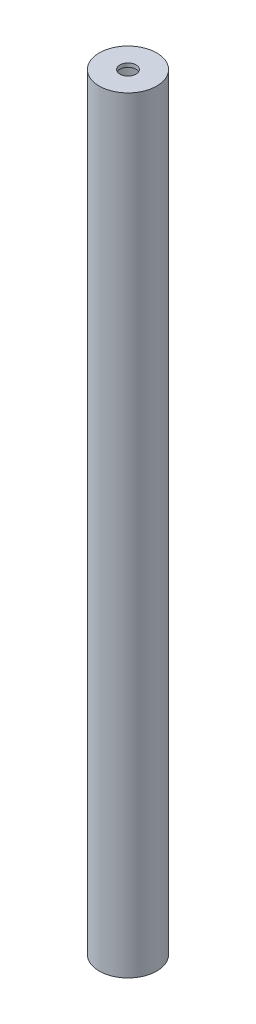
ISO-10303-21;
HEADER;
FILE_DESCRIPTION(('STEP AP214'),'2;1');
FILE_NAME('part.step','',(''),(''),'','','');
FILE_SCHEMA(('AUTOMOTIVE_DESIGN { 1 0 10303 214 1 1 1 1 }'));
ENDSEC;
DATA;
#1=APPLICATION_CONTEXT('core data for automotive mechanical design processes');
#2=APPLICATION_PROTOCOL_DEFINITION('international standard','automotive_design',2000,#1);
#3=PRODUCT_CONTEXT('',#1,'mechanical');
#4=PRODUCT('Part','Part','',(#3));
#5=PRODUCT_RELATED_PRODUCT_CATEGORY('part','',(#4));
#6=PRODUCT_DEFINITION_FORMATION('','',#4);
#7=PRODUCT_DEFINITION_CONTEXT('part definition',#1,'design');
#8=PRODUCT_DEFINITION('design','',#6,#7);
#9=PRODUCT_DEFINITION_SHAPE('','',#8);
#10=(LENGTH_UNIT() NAMED_UNIT(*) SI_UNIT(.MILLI.,.METRE.));
#11=(NAMED_UNIT(*) PLANE_ANGLE_UNIT() SI_UNIT($,.RADIAN.));
#12=(NAMED_UNIT(*) SI_UNIT($,.STERADIAN.) SOLID_ANGLE_UNIT());
#13=UNCERTAINTY_MEASURE_WITH_UNIT(LENGTH_MEASURE(1.E-05),#10,'distance_accuracy_value','');
#14=(GEOMETRIC_REPRESENTATION_CONTEXT(3) GLOBAL_UNCERTAINTY_ASSIGNED_CONTEXT((#13)) GLOBAL_UNIT_ASSIGNED_CONTEXT((#10,
#11,#12)) REPRESENTATION_CONTEXT('',''));
#15=CARTESIAN_POINT('',(0.,0.,0.));
#16=DIRECTION('',(0.,0.,1.));
#17=DIRECTION('',(1.,0.,0.));
#18=AXIS2_PLACEMENT_3D('',#15,#16,#17);
#19=CARTESIAN_POINT('',(0.,200.,0.));
#20=DIRECTION('',(0.,-1.,0.));
#21=DIRECTION('',(0.,0.,-1.));
#22=AXIS2_PLACEMENT_3D('',#19,#20,#21);
#23=CYLINDRICAL_SURFACE('',#22,7.);
#24=CARTESIAN_POINT('',(0.,0.,0.));
#25=DIRECTION('',(0.,1.,0.));
#26=DIRECTION('',(0.,0.,1.));
#27=AXIS2_PLACEMENT_3D('',#24,#25,#26);
#28=CIRCLE('',#27,7.);
#29=CARTESIAN_POINT('',(0.,0.,7.));
#30=VERTEX_POINT('',#29);
#31=EDGE_CURVE('E55',#30,#30,#28,.T.);
#32=ORIENTED_EDGE('',*,*,#31,.F.);
#33=EDGE_LOOP('',(#32));
#34=FACE_BOUND('',#33,.T.);
#35=CARTESIAN_POINT('',(0.,199.,0.));
#36=DIRECTION('',(0.,1.,0.));
#37=DIRECTION('',(0.,0.,1.));
#38=AXIS2_PLACEMENT_3D('',#35,#36,#37);
#39=CIRCLE('',#38,7.);
#40=CARTESIAN_POINT('',(0.,199.,7.));
#41=VERTEX_POINT('',#40);
#42=EDGE_CURVE('E60',#41,#41,#39,.T.);
#43=ORIENTED_EDGE('',*,*,#42,.T.);
#44=EDGE_LOOP('',(#43));
#45=FACE_BOUND('',#44,.T.);
#46=ADVANCED_FACE('F40',(#34,#45),#23,.F.);
#47=CARTESIAN_POINT('',(0.,200.,0.));
#48=DIRECTION('',(0.,1.,0.));
#49=DIRECTION('',(0.,0.,1.));
#50=AXIS2_PLACEMENT_3D('',#47,#48,#49);
#51=PLANE('',#50);
#52=CARTESIAN_POINT('',(0.,200.,0.));
#53=DIRECTION('',(0.,1.,0.));
#54=DIRECTION('',(0.,0.,1.));
#55=AXIS2_PLACEMENT_3D('',#52,#53,#54);
#56=CIRCLE('',#55,2.1);
#57=CARTESIAN_POINT('',(0.,200.,2.1));
#58=VERTEX_POINT('',#57);
#59=EDGE_CURVE('E64',#58,#58,#56,.T.);
#60=ORIENTED_EDGE('',*,*,#59,.F.);
#61=EDGE_LOOP('',(#60));
#62=FACE_BOUND('',#61,.T.);
#63=CARTESIAN_POINT('',(0.,200.,0.));
#64=DIRECTION('',(0.,1.,0.));
#65=DIRECTION('',(0.,0.,1.));
#66=AXIS2_PLACEMENT_3D('',#63,#64,#65);
#67=CIRCLE('',#66,7.5);
#68=CARTESIAN_POINT('',(0.,200.,7.5));
#69=VERTEX_POINT('',#68);
#70=EDGE_CURVE('E10',#69,#69,#67,.T.);
#71=ORIENTED_EDGE('',*,*,#70,.T.);
#72=EDGE_LOOP('',(#71));
#73=FACE_BOUND('',#72,.T.);
#74=ADVANCED_FACE('F85',(#62,#73),#51,.T.);
#75=CARTESIAN_POINT('',(0.,0.,0.));
#76=DIRECTION('',(0.,1.,0.));
#77=DIRECTION('',(0.,0.,1.));
#78=AXIS2_PLACEMENT_3D('',#75,#76,#77);
#79=PLANE('',#78);
#80=CARTESIAN_POINT('',(0.,0.,0.));
#81=DIRECTION('',(0.,1.,0.));
#82=DIRECTION('',(0.,0.,1.));
#83=AXIS2_PLACEMENT_3D('',#80,#81,#82);
#84=CIRCLE('',#83,7.5);
#85=CARTESIAN_POINT('',(0.,0.,7.5));
#86=VERTEX_POINT('',#85);
#87=EDGE_CURVE('E49',#86,#86,#84,.T.);
#88=ORIENTED_EDGE('',*,*,#87,.F.);
#89=EDGE_LOOP('',(#88));
#90=FACE_BOUND('',#89,.T.);
#91=ORIENTED_EDGE('',*,*,#31,.T.);
#92=EDGE_LOOP('',(#91));
#93=FACE_BOUND('',#92,.T.);
#94=ADVANCED_FACE('F92',(#90,#93),#79,.F.);
#95=CARTESIAN_POINT('',(0.,200.,0.));
#96=DIRECTION('',(0.,-1.,0.));
#97=DIRECTION('',(0.,0.,-1.));
#98=AXIS2_PLACEMENT_3D('',#95,#96,#97);
#99=CYLINDRICAL_SURFACE('',#98,7.5);
#100=ORIENTED_EDGE('',*,*,#70,.F.);
#101=EDGE_LOOP('',(#100));
#102=FACE_BOUND('',#101,.T.);
#103=ORIENTED_EDGE('',*,*,#87,.T.);
#104=EDGE_LOOP('',(#103));
#105=FACE_BOUND('',#104,.T.);
#106=ADVANCED_FACE('F42',(#102,#105),#99,.T.);
#107=CARTESIAN_POINT('',(0.,199.,0.));
#108=DIRECTION('',(0.,1.,0.));
#109=DIRECTION('',(0.,0.,1.));
#110=AXIS2_PLACEMENT_3D('',#107,#108,#109);
#111=PLANE('',#110);
#112=CARTESIAN_POINT('',(0.,199.,0.));
#113=DIRECTION('',(0.,1.,0.));
#114=DIRECTION('',(0.,0.,1.));
#115=AXIS2_PLACEMENT_3D('',#112,#113,#114);
#116=CIRCLE('',#115,2.1);
#117=CARTESIAN_POINT('',(0.,199.,2.1));
#118=VERTEX_POINT('',#117);
#119=EDGE_CURVE('E44',#118,#118,#116,.T.);
#120=ORIENTED_EDGE('',*,*,#119,.T.);
#121=EDGE_LOOP('',(#120));
#122=FACE_BOUND('',#121,.T.);
#123=ORIENTED_EDGE('',*,*,#42,.F.);
#124=EDGE_LOOP('',(#123));
#125=FACE_BOUND('',#124,.T.);
#126=ADVANCED_FACE('F73',(#122,#125),#111,.F.);
#127=CARTESIAN_POINT('',(0.,190.,0.));
#128=DIRECTION('',(0.,1.,0.));
#129=DIRECTION('',(0.,0.,1.));
#130=AXIS2_PLACEMENT_3D('',#127,#128,#129);
#131=CYLINDRICAL_SURFACE('',#130,2.1);
#132=ORIENTED_EDGE('',*,*,#59,.T.);
#133=EDGE_LOOP('',(#132));
#134=FACE_BOUND('',#133,.T.);
#135=ORIENTED_EDGE('',*,*,#119,.F.);
#136=EDGE_LOOP('',(#135));
#137=FACE_BOUND('',#136,.T.);
#138=ADVANCED_FACE('F76',(#134,#137),#131,.F.);
#139=CLOSED_SHELL('',(#46,#74,#94,#106,#126,#138));
#140=MANIFOLD_SOLID_BREP('B2',#139);
#141=ADVANCED_BREP_SHAPE_REPRESENTATION('',(#18,#140),#14);
#142=SHAPE_DEFINITION_REPRESENTATION(#9,#141);
ENDSEC;
END-ISO-10303-21;
